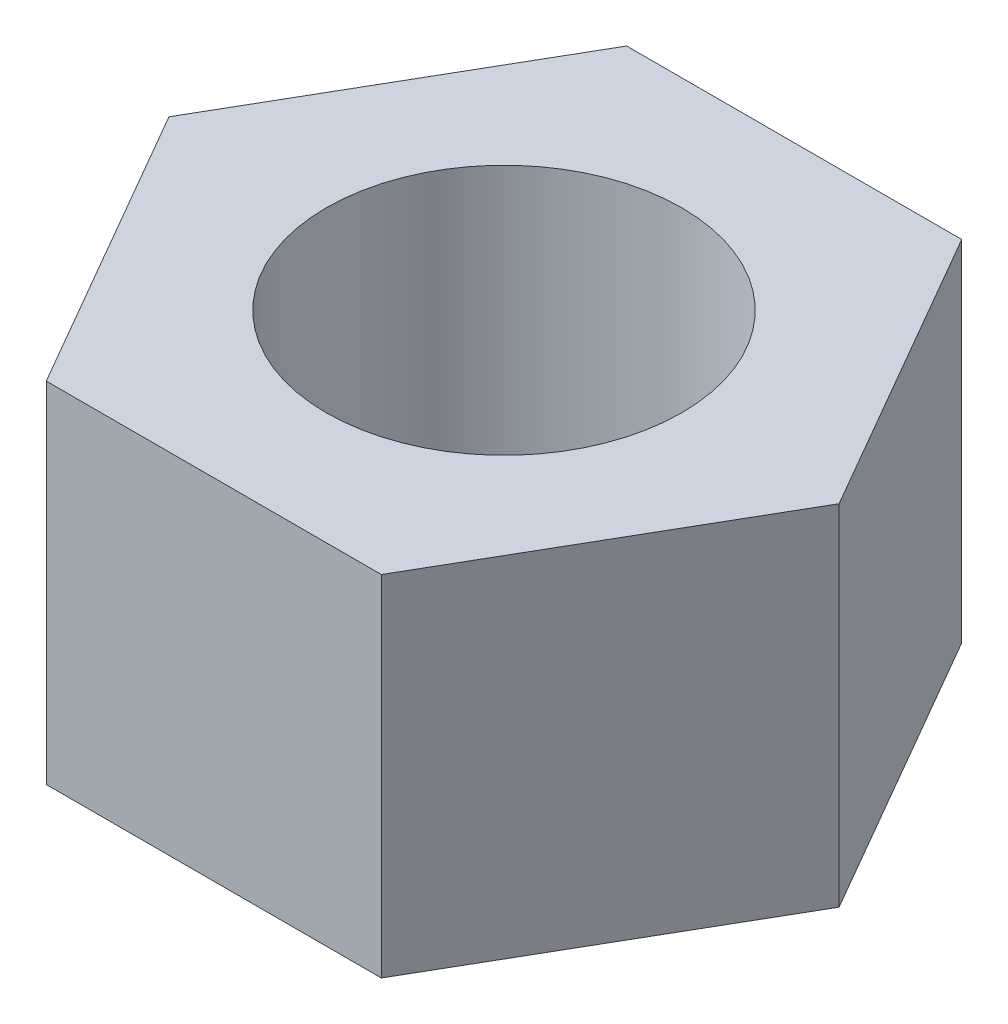
ISO-10303-21;
HEADER;
FILE_DESCRIPTION(('STEP AP214'),'2;1');
FILE_NAME('part.step','',(''),(''),'','','');
FILE_SCHEMA(('AUTOMOTIVE_DESIGN { 1 0 10303 214 1 1 1 1 }'));
ENDSEC;
DATA;
#1=APPLICATION_CONTEXT('core data for automotive mechanical design processes');
#2=APPLICATION_PROTOCOL_DEFINITION('international standard','automotive_design',2000,#1);
#3=PRODUCT_CONTEXT('',#1,'mechanical');
#4=PRODUCT('Part','Part','',(#3));
#5=PRODUCT_RELATED_PRODUCT_CATEGORY('part','',(#4));
#6=PRODUCT_DEFINITION_FORMATION('','',#4);
#7=PRODUCT_DEFINITION_CONTEXT('part definition',#1,'design');
#8=PRODUCT_DEFINITION('design','',#6,#7);
#9=PRODUCT_DEFINITION_SHAPE('','',#8);
#10=(LENGTH_UNIT() NAMED_UNIT(*) SI_UNIT(.MILLI.,.METRE.));
#11=(NAMED_UNIT(*) PLANE_ANGLE_UNIT() SI_UNIT($,.RADIAN.));
#12=(NAMED_UNIT(*) SI_UNIT($,.STERADIAN.) SOLID_ANGLE_UNIT());
#13=UNCERTAINTY_MEASURE_WITH_UNIT(LENGTH_MEASURE(1.E-05),#10,'distance_accuracy_value','');
#14=(GEOMETRIC_REPRESENTATION_CONTEXT(3) GLOBAL_UNCERTAINTY_ASSIGNED_CONTEXT((#13)) GLOBAL_UNIT_ASSIGNED_CONTEXT((#10,
#11,#12)) REPRESENTATION_CONTEXT('',''));
#15=CARTESIAN_POINT('',(0.,0.,0.));
#16=DIRECTION('',(0.,0.,1.));
#17=DIRECTION('',(1.,0.,0.));
#18=AXIS2_PLACEMENT_3D('',#15,#16,#17);
#19=CARTESIAN_POINT('',(0.,5.9,0.));
#20=DIRECTION('',(0.,1.,0.));
#21=DIRECTION('',(0.,0.,1.));
#22=AXIS2_PLACEMENT_3D('',#19,#20,#21);
#23=PLANE('',#22);
#24=DIRECTION('',(0.499999999999995,0.,-0.866025403784442));
#25=VECTOR('',#24,1.);
#26=CARTESIAN_POINT('',(2.82901631902923,5.9,4.89999999999997));
#27=LINE('',#26,#25);
#28=CARTESIAN_POINT('',(2.82901631902923,5.9,4.89999999999997));
#29=VERTEX_POINT('',#28);
#30=CARTESIAN_POINT('',(5.65803263805834,5.9,0.));
#31=VERTEX_POINT('',#30);
#32=EDGE_CURVE('E146',#29,#31,#27,.T.);
#33=ORIENTED_EDGE('',*,*,#32,.T.);
#34=DIRECTION('',(-0.500000000000001,0.,-0.866025403784438));
#35=VECTOR('',#34,1.);
#36=CARTESIAN_POINT('',(5.65803263805834,5.9,0.));
#37=LINE('',#36,#35);
#38=CARTESIAN_POINT('',(2.82901631902916,5.9,-4.90000000000001));
#39=VERTEX_POINT('',#38);
#40=EDGE_CURVE('E94',#31,#39,#37,.T.);
#41=ORIENTED_EDGE('',*,*,#40,.T.);
#42=DIRECTION('',(-1.,0.,0.));
#43=VECTOR('',#42,1.);
#44=CARTESIAN_POINT('',(2.82901631902916,5.9,-4.90000000000001));
#45=LINE('',#44,#43);
#46=CARTESIAN_POINT('',(-2.82901631902919,5.9,-4.89999999999999));
#47=VERTEX_POINT('',#46);
#48=EDGE_CURVE('E107',#39,#47,#45,.T.);
#49=ORIENTED_EDGE('',*,*,#48,.T.);
#50=DIRECTION('',(-0.499999999999995,0.,0.866025403784442));
#51=VECTOR('',#50,1.);
#52=CARTESIAN_POINT('',(-2.82901631902919,5.9,-4.89999999999999));
#53=LINE('',#52,#51);
#54=CARTESIAN_POINT('',(-5.65803263805834,5.9,0.));
#55=VERTEX_POINT('',#54);
#56=EDGE_CURVE('E101',#47,#55,#53,.T.);
#57=ORIENTED_EDGE('',*,*,#56,.T.);
#58=DIRECTION('',(0.500000000000007,0.,0.866025403784434));
#59=VECTOR('',#58,1.);
#60=CARTESIAN_POINT('',(-5.65803263805834,5.9,0.));
#61=LINE('',#60,#59);
#62=CARTESIAN_POINT('',(-2.82901631902912,5.9,4.90000000000003));
#63=VERTEX_POINT('',#62);
#64=EDGE_CURVE('E105',#55,#63,#61,.T.);
#65=ORIENTED_EDGE('',*,*,#64,.T.);
#66=DIRECTION('',(1.,0.,0.));
#67=VECTOR('',#66,1.);
#68=CARTESIAN_POINT('',(-2.82901631902912,5.9,4.90000000000003));
#69=LINE('',#68,#67);
#70=EDGE_CURVE('E57',#63,#29,#69,.T.);
#71=ORIENTED_EDGE('',*,*,#70,.T.);
#72=EDGE_LOOP('',(#33,#41,#49,#57,#65,#71));
#73=FACE_BOUND('',#72,.T.);
#74=CARTESIAN_POINT('',(0.,5.9,0.));
#75=DIRECTION('',(0.,1.,0.));
#76=DIRECTION('',(0.,0.,1.));
#77=AXIS2_PLACEMENT_3D('',#74,#75,#76);
#78=CIRCLE('',#77,3.);
#79=CARTESIAN_POINT('',(0.,5.9,3.));
#80=VERTEX_POINT('',#79);
#81=EDGE_CURVE('E134',#80,#80,#78,.T.);
#82=ORIENTED_EDGE('',*,*,#81,.F.);
#83=EDGE_LOOP('',(#82));
#84=FACE_BOUND('',#83,.T.);
#85=ADVANCED_FACE('F39',(#73,#84),#23,.T.);
#86=CARTESIAN_POINT('',(0.,0.,0.));
#87=DIRECTION('',(0.,1.,0.));
#88=DIRECTION('',(0.,0.,1.));
#89=AXIS2_PLACEMENT_3D('',#86,#87,#88);
#90=PLANE('',#89);
#91=DIRECTION('',(0.499999999999995,0.,-0.866025403784442));
#92=VECTOR('',#91,1.);
#93=CARTESIAN_POINT('',(2.82901631902923,0.,4.89999999999997));
#94=LINE('',#93,#92);
#95=CARTESIAN_POINT('',(2.82901631902923,0.,4.89999999999997));
#96=VERTEX_POINT('',#95);
#97=CARTESIAN_POINT('',(5.65803263805834,0.,0.));
#98=VERTEX_POINT('',#97);
#99=EDGE_CURVE('E129',#96,#98,#94,.T.);
#100=ORIENTED_EDGE('',*,*,#99,.F.);
#101=DIRECTION('',(1.,0.,0.));
#102=VECTOR('',#101,1.);
#103=CARTESIAN_POINT('',(-2.82901631902912,0.,4.90000000000003));
#104=LINE('',#103,#102);
#105=CARTESIAN_POINT('',(-2.82901631902912,0.,4.90000000000003));
#106=VERTEX_POINT('',#105);
#107=EDGE_CURVE('E86',#106,#96,#104,.T.);
#108=ORIENTED_EDGE('',*,*,#107,.F.);
#109=DIRECTION('',(0.500000000000007,0.,0.866025403784434));
#110=VECTOR('',#109,1.);
#111=CARTESIAN_POINT('',(-5.65803263805834,0.,0.));
#112=LINE('',#111,#110);
#113=CARTESIAN_POINT('',(-5.65803263805834,0.,0.));
#114=VERTEX_POINT('',#113);
#115=EDGE_CURVE('E80',#114,#106,#112,.T.);
#116=ORIENTED_EDGE('',*,*,#115,.F.);
#117=DIRECTION('',(-0.499999999999995,0.,0.866025403784442));
#118=VECTOR('',#117,1.);
#119=CARTESIAN_POINT('',(-2.82901631902919,0.,-4.89999999999999));
#120=LINE('',#119,#118);
#121=CARTESIAN_POINT('',(-2.82901631902919,0.,-4.89999999999999));
#122=VERTEX_POINT('',#121);
#123=EDGE_CURVE('E116',#122,#114,#120,.T.);
#124=ORIENTED_EDGE('',*,*,#123,.F.);
#125=DIRECTION('',(-1.,0.,0.));
#126=VECTOR('',#125,1.);
#127=CARTESIAN_POINT('',(2.82901631902916,0.,-4.90000000000001));
#128=LINE('',#127,#126);
#129=CARTESIAN_POINT('',(2.82901631902916,0.,-4.90000000000001));
#130=VERTEX_POINT('',#129);
#131=EDGE_CURVE('E137',#130,#122,#128,.T.);
#132=ORIENTED_EDGE('',*,*,#131,.F.);
#133=DIRECTION('',(-0.500000000000001,0.,-0.866025403784438));
#134=VECTOR('',#133,1.);
#135=CARTESIAN_POINT('',(5.65803263805834,0.,0.));
#136=LINE('',#135,#134);
#137=EDGE_CURVE('E133',#98,#130,#136,.T.);
#138=ORIENTED_EDGE('',*,*,#137,.F.);
#139=EDGE_LOOP('',(#100,#108,#116,#124,#132,#138));
#140=FACE_BOUND('',#139,.T.);
#141=CARTESIAN_POINT('',(0.,0.,0.));
#142=DIRECTION('',(0.,1.,0.));
#143=DIRECTION('',(0.,0.,1.));
#144=AXIS2_PLACEMENT_3D('',#141,#142,#143);
#145=CIRCLE('',#144,3.);
#146=CARTESIAN_POINT('',(0.,0.,3.));
#147=VERTEX_POINT('',#146);
#148=EDGE_CURVE('E243',#147,#147,#145,.T.);
#149=ORIENTED_EDGE('',*,*,#148,.T.);
#150=EDGE_LOOP('',(#149));
#151=FACE_BOUND('',#150,.T.);
#152=ADVANCED_FACE('F159',(#140,#151),#90,.F.);
#153=CARTESIAN_POINT('',(2.82901631902923,5.9,4.89999999999997));
#154=DIRECTION('',(-0.866025403784442,0.,-0.499999999999995));
#155=DIRECTION('',(-0.499999999999995,0.,0.866025403784442));
#156=AXIS2_PLACEMENT_3D('',#153,#154,#155);
#157=PLANE('',#156);
#158=ORIENTED_EDGE('',*,*,#99,.T.);
#159=DIRECTION('',(0.,-1.,0.));
#160=VECTOR('',#159,1.);
#161=CARTESIAN_POINT('',(5.65803263805834,5.9,0.));
#162=LINE('',#161,#160);
#163=EDGE_CURVE('E11',#31,#98,#162,.T.);
#164=ORIENTED_EDGE('',*,*,#163,.F.);
#165=ORIENTED_EDGE('',*,*,#32,.F.);
#166=DIRECTION('',(0.,-1.,0.));
#167=VECTOR('',#166,1.);
#168=CARTESIAN_POINT('',(2.82901631902923,5.9,4.89999999999997));
#169=LINE('',#168,#167);
#170=EDGE_CURVE('E125',#29,#96,#169,.T.);
#171=ORIENTED_EDGE('',*,*,#170,.T.);
#172=EDGE_LOOP('',(#158,#164,#165,#171));
#173=FACE_BOUND('',#172,.T.);
#174=ADVANCED_FACE('F41',(#173),#157,.F.);
#175=CARTESIAN_POINT('',(5.65803263805834,5.9,0.));
#176=DIRECTION('',(-0.866025403784438,0.,0.500000000000001));
#177=DIRECTION('',(0.500000000000001,0.,0.866025403784438));
#178=AXIS2_PLACEMENT_3D('',#175,#176,#177);
#179=PLANE('',#178);
#180=ORIENTED_EDGE('',*,*,#137,.T.);
#181=DIRECTION('',(0.,-1.,0.));
#182=VECTOR('',#181,1.);
#183=CARTESIAN_POINT('',(2.82901631902916,5.9,-4.90000000000001));
#184=LINE('',#183,#182);
#185=EDGE_CURVE('E49',#39,#130,#184,.T.);
#186=ORIENTED_EDGE('',*,*,#185,.F.);
#187=ORIENTED_EDGE('',*,*,#40,.F.);
#188=ORIENTED_EDGE('',*,*,#163,.T.);
#189=EDGE_LOOP('',(#180,#186,#187,#188));
#190=FACE_BOUND('',#189,.T.);
#191=ADVANCED_FACE('F184',(#190),#179,.F.);
#192=CARTESIAN_POINT('',(2.82901631902916,5.9,-4.90000000000001));
#193=DIRECTION('',(0.,0.,1.));
#194=DIRECTION('',(1.,0.,0.));
#195=AXIS2_PLACEMENT_3D('',#192,#193,#194);
#196=PLANE('',#195);
#197=ORIENTED_EDGE('',*,*,#131,.T.);
#198=DIRECTION('',(0.,-1.,0.));
#199=VECTOR('',#198,1.);
#200=CARTESIAN_POINT('',(-2.82901631902919,5.9,-4.89999999999999));
#201=LINE('',#200,#199);
#202=EDGE_CURVE('E118',#47,#122,#201,.T.);
#203=ORIENTED_EDGE('',*,*,#202,.F.);
#204=ORIENTED_EDGE('',*,*,#48,.F.);
#205=ORIENTED_EDGE('',*,*,#185,.T.);
#206=EDGE_LOOP('',(#197,#203,#204,#205));
#207=FACE_BOUND('',#206,.T.);
#208=ADVANCED_FACE('F156',(#207),#196,.F.);
#209=CARTESIAN_POINT('',(-2.82901631902919,5.9,-4.89999999999999));
#210=DIRECTION('',(0.866025403784441,0.,0.499999999999995));
#211=DIRECTION('',(0.499999999999995,0.,-0.866025403784442));
#212=AXIS2_PLACEMENT_3D('',#209,#210,#211);
#213=PLANE('',#212);
#214=ORIENTED_EDGE('',*,*,#123,.T.);
#215=DIRECTION('',(0.,-1.,0.));
#216=VECTOR('',#215,1.);
#217=CARTESIAN_POINT('',(-5.65803263805834,5.9,0.));
#218=LINE('',#217,#216);
#219=EDGE_CURVE('E113',#55,#114,#218,.T.);
#220=ORIENTED_EDGE('',*,*,#219,.F.);
#221=ORIENTED_EDGE('',*,*,#56,.F.);
#222=ORIENTED_EDGE('',*,*,#202,.T.);
#223=EDGE_LOOP('',(#214,#220,#221,#222));
#224=FACE_BOUND('',#223,.T.);
#225=ADVANCED_FACE('F114',(#224),#213,.F.);
#226=CARTESIAN_POINT('',(-5.65803263805834,5.9,0.));
#227=DIRECTION('',(0.866025403784435,0.,-0.500000000000007));
#228=DIRECTION('',(-0.500000000000007,0.,-0.866025403784435));
#229=AXIS2_PLACEMENT_3D('',#226,#227,#228);
#230=PLANE('',#229);
#231=ORIENTED_EDGE('',*,*,#115,.T.);
#232=DIRECTION('',(0.,-1.,0.));
#233=VECTOR('',#232,1.);
#234=CARTESIAN_POINT('',(-2.82901631902912,5.9,4.90000000000003));
#235=LINE('',#234,#233);
#236=EDGE_CURVE('E119',#63,#106,#235,.T.);
#237=ORIENTED_EDGE('',*,*,#236,.F.);
#238=ORIENTED_EDGE('',*,*,#64,.F.);
#239=ORIENTED_EDGE('',*,*,#219,.T.);
#240=EDGE_LOOP('',(#231,#237,#238,#239));
#241=FACE_BOUND('',#240,.T.);
#242=ADVANCED_FACE('F121',(#241),#230,.F.);
#243=CARTESIAN_POINT('',(-2.82901631902912,5.9,4.90000000000003));
#244=DIRECTION('',(0.,0.,-1.));
#245=DIRECTION('',(-1.,0.,0.));
#246=AXIS2_PLACEMENT_3D('',#243,#244,#245);
#247=PLANE('',#246);
#248=ORIENTED_EDGE('',*,*,#107,.T.);
#249=ORIENTED_EDGE('',*,*,#170,.F.);
#250=ORIENTED_EDGE('',*,*,#70,.F.);
#251=ORIENTED_EDGE('',*,*,#236,.T.);
#252=EDGE_LOOP('',(#248,#249,#250,#251));
#253=FACE_BOUND('',#252,.T.);
#254=ADVANCED_FACE('F164',(#253),#247,.F.);
#255=CARTESIAN_POINT('',(0.,5.9,0.));
#256=DIRECTION('',(0.,-1.,0.));
#257=DIRECTION('',(0.,0.,-1.));
#258=AXIS2_PLACEMENT_3D('',#255,#256,#257);
#259=CYLINDRICAL_SURFACE('',#258,3.);
#260=ORIENTED_EDGE('',*,*,#81,.T.);
#261=EDGE_LOOP('',(#260));
#262=FACE_BOUND('',#261,.T.);
#263=ORIENTED_EDGE('',*,*,#148,.F.);
#264=EDGE_LOOP('',(#263));
#265=FACE_BOUND('',#264,.T.);
#266=ADVANCED_FACE('F166',(#262,#265),#259,.F.);
#267=CLOSED_SHELL('',(#85,#152,#174,#191,#208,#225,#242,#254,#266));
#268=MANIFOLD_SOLID_BREP('B2',#267);
#269=ADVANCED_BREP_SHAPE_REPRESENTATION('',(#18,#268),#14);
#270=SHAPE_DEFINITION_REPRESENTATION(#9,#269);
ENDSEC;
END-ISO-10303-21;
